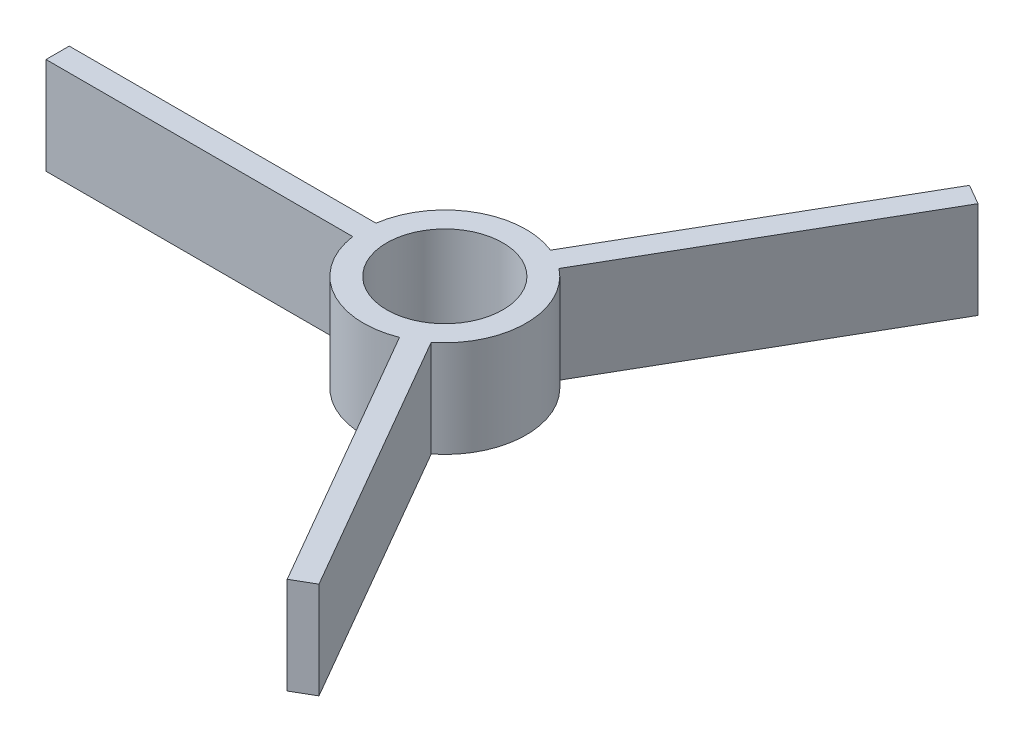
ISO-10303-21;
HEADER;
FILE_DESCRIPTION(('STEP AP214'),'2;1');
FILE_NAME('part.step','',(''),(''),'','','');
FILE_SCHEMA(('AUTOMOTIVE_DESIGN { 1 0 10303 214 1 1 1 1 }'));
ENDSEC;
DATA;
#1=APPLICATION_CONTEXT('core data for automotive mechanical design processes');
#2=APPLICATION_PROTOCOL_DEFINITION('international standard','automotive_design',2000,#1);
#3=PRODUCT_CONTEXT('',#1,'mechanical');
#4=PRODUCT('Part','Part','',(#3));
#5=PRODUCT_RELATED_PRODUCT_CATEGORY('part','',(#4));
#6=PRODUCT_DEFINITION_FORMATION('','',#4);
#7=PRODUCT_DEFINITION_CONTEXT('part definition',#1,'design');
#8=PRODUCT_DEFINITION('design','',#6,#7);
#9=PRODUCT_DEFINITION_SHAPE('','',#8);
#10=(LENGTH_UNIT() NAMED_UNIT(*) SI_UNIT(.MILLI.,.METRE.));
#11=(NAMED_UNIT(*) PLANE_ANGLE_UNIT() SI_UNIT($,.RADIAN.));
#12=(NAMED_UNIT(*) SI_UNIT($,.STERADIAN.) SOLID_ANGLE_UNIT());
#13=UNCERTAINTY_MEASURE_WITH_UNIT(LENGTH_MEASURE(1.E-05),#10,'distance_accuracy_value','');
#14=(GEOMETRIC_REPRESENTATION_CONTEXT(3) GLOBAL_UNCERTAINTY_ASSIGNED_CONTEXT((#13)) GLOBAL_UNIT_ASSIGNED_CONTEXT((#10,
#11,#12)) REPRESENTATION_CONTEXT('',''));
#15=CARTESIAN_POINT('',(0.,0.,0.));
#16=DIRECTION('',(0.,0.,1.));
#17=DIRECTION('',(1.,0.,0.));
#18=AXIS2_PLACEMENT_3D('',#15,#16,#17);
#19=CARTESIAN_POINT('',(0.,5.,0.));
#20=DIRECTION('',(0.,1.,0.));
#21=DIRECTION('',(0.,0.,1.));
#22=AXIS2_PLACEMENT_3D('',#19,#20,#21);
#23=PLANE('',#22);
#24=CARTESIAN_POINT('',(0.,5.,0.));
#25=DIRECTION('',(0.,1.,0.));
#26=DIRECTION('',(0.,0.,1.));
#27=AXIS2_PLACEMENT_3D('',#24,#25,#26);
#28=CIRCLE('',#27,4.2);
#29=CARTESIAN_POINT('',(-4.15692193816531,5.,0.6));
#30=VERTEX_POINT('',#29);
#31=CARTESIAN_POINT('',(1.55884572681199,5.,3.9));
#32=VERTEX_POINT('',#31);
#33=EDGE_CURVE('E186',#30,#32,#28,.T.);
#34=ORIENTED_EDGE('',*,*,#33,.T.);
#35=DIRECTION('',(0.500000000000001,0.,0.866025403784438));
#36=VECTOR('',#35,1.);
#37=CARTESIAN_POINT('',(1.55884572681199,5.,3.9));
#38=LINE('',#37,#36);
#39=CARTESIAN_POINT('',(9.48038475772935,5.,17.6205080756888));
#40=VERTEX_POINT('',#39);
#41=EDGE_CURVE('E114',#32,#40,#38,.T.);
#42=ORIENTED_EDGE('',*,*,#41,.T.);
#43=DIRECTION('',(0.866025403784439,0.,-0.5));
#44=VECTOR('',#43,1.);
#45=CARTESIAN_POINT('',(9.48038475772935,5.,17.6205080756888));
#46=LINE('',#45,#44);
#47=CARTESIAN_POINT('',(10.5196152422707,5.,17.0205080756888));
#48=VERTEX_POINT('',#47);
#49=EDGE_CURVE('E213',#40,#48,#46,.T.);
#50=ORIENTED_EDGE('',*,*,#49,.T.);
#51=DIRECTION('',(-0.500000000000001,0.,-0.866025403784438));
#52=VECTOR('',#51,1.);
#53=CARTESIAN_POINT('',(2.59807621135332,5.,3.3));
#54=LINE('',#53,#52);
#55=CARTESIAN_POINT('',(2.59807621135332,5.,3.3));
#56=VERTEX_POINT('',#55);
#57=EDGE_CURVE('E232',#48,#56,#54,.T.);
#58=ORIENTED_EDGE('',*,*,#57,.T.);
#59=CARTESIAN_POINT('',(0.,5.,0.));
#60=DIRECTION('',(0.,1.,0.));
#61=DIRECTION('',(0.,0.,1.));
#62=AXIS2_PLACEMENT_3D('',#59,#60,#61);
#63=CIRCLE('',#62,4.2);
#64=CARTESIAN_POINT('',(2.59807621135331,5.,-3.3));
#65=VERTEX_POINT('',#64);
#66=EDGE_CURVE('E229',#56,#65,#63,.T.);
#67=ORIENTED_EDGE('',*,*,#66,.T.);
#68=DIRECTION('',(0.5,0.,-0.866025403784439));
#69=VECTOR('',#68,1.);
#70=CARTESIAN_POINT('',(2.59807621135331,5.,-3.3));
#71=LINE('',#70,#69);
#72=CARTESIAN_POINT('',(10.5196152422707,5.,-17.0205080756888));
#73=VERTEX_POINT('',#72);
#74=EDGE_CURVE('E231',#65,#73,#71,.T.);
#75=ORIENTED_EDGE('',*,*,#74,.T.);
#76=DIRECTION('',(-0.866025403784439,0.,-0.5));
#77=VECTOR('',#76,1.);
#78=CARTESIAN_POINT('',(10.5196152422707,5.,-17.0205080756888));
#79=LINE('',#78,#77);
#80=CARTESIAN_POINT('',(9.48038475772933,5.,-17.6205080756888));
#81=VERTEX_POINT('',#80);
#82=EDGE_CURVE('E234',#73,#81,#79,.T.);
#83=ORIENTED_EDGE('',*,*,#82,.T.);
#84=DIRECTION('',(-0.5,0.,0.866025403784439));
#85=VECTOR('',#84,1.);
#86=CARTESIAN_POINT('',(1.55884572681199,5.,-3.9));
#87=LINE('',#86,#85);
#88=CARTESIAN_POINT('',(1.55884572681199,5.,-3.9));
#89=VERTEX_POINT('',#88);
#90=EDGE_CURVE('E240',#81,#89,#87,.T.);
#91=ORIENTED_EDGE('',*,*,#90,.T.);
#92=CARTESIAN_POINT('',(0.,5.,0.));
#93=DIRECTION('',(0.,1.,0.));
#94=DIRECTION('',(0.,0.,1.));
#95=AXIS2_PLACEMENT_3D('',#92,#93,#94);
#96=CIRCLE('',#95,4.2);
#97=CARTESIAN_POINT('',(-4.15692193816531,5.,-0.599999999999999));
#98=VERTEX_POINT('',#97);
#99=EDGE_CURVE('E145',#89,#98,#96,.T.);
#100=ORIENTED_EDGE('',*,*,#99,.T.);
#101=DIRECTION('',(-1.,0.,0.));
#102=VECTOR('',#101,1.);
#103=CARTESIAN_POINT('',(-4.15692193816531,5.,-0.599999999999999));
#104=LINE('',#103,#102);
#105=CARTESIAN_POINT('',(-20.,5.,-0.599999999999997));
#106=VERTEX_POINT('',#105);
#107=EDGE_CURVE('E139',#98,#106,#104,.T.);
#108=ORIENTED_EDGE('',*,*,#107,.T.);
#109=DIRECTION('',(0.,0.,1.));
#110=VECTOR('',#109,1.);
#111=CARTESIAN_POINT('',(-20.,5.,-0.599999999999997));
#112=LINE('',#111,#110);
#113=CARTESIAN_POINT('',(-20.,5.,0.600000000000002));
#114=VERTEX_POINT('',#113);
#115=EDGE_CURVE('E143',#106,#114,#112,.T.);
#116=ORIENTED_EDGE('',*,*,#115,.T.);
#117=DIRECTION('',(1.,0.,0.));
#118=VECTOR('',#117,1.);
#119=CARTESIAN_POINT('',(-4.15692193816531,5.,0.6));
#120=LINE('',#119,#118);
#121=EDGE_CURVE('E59',#114,#30,#120,.T.);
#122=ORIENTED_EDGE('',*,*,#121,.T.);
#123=EDGE_LOOP('',(#34,#42,#50,#58,#67,#75,#83,#91,#100,#108,#116,#122));
#124=FACE_BOUND('',#123,.T.);
#125=CARTESIAN_POINT('',(0.,5.,0.));
#126=DIRECTION('',(0.,1.,0.));
#127=DIRECTION('',(0.,0.,1.));
#128=AXIS2_PLACEMENT_3D('',#125,#126,#127);
#129=CIRCLE('',#128,3.);
#130=CARTESIAN_POINT('',(0.,5.,3.));
#131=VERTEX_POINT('',#130);
#132=EDGE_CURVE('E167',#131,#131,#129,.T.);
#133=ORIENTED_EDGE('',*,*,#132,.F.);
#134=EDGE_LOOP('',(#133));
#135=FACE_BOUND('',#134,.T.);
#136=ADVANCED_FACE('F42',(#124,#135),#23,.T.);
#137=CARTESIAN_POINT('',(0.,0.,0.));
#138=DIRECTION('',(0.,1.,0.));
#139=DIRECTION('',(0.,0.,1.));
#140=AXIS2_PLACEMENT_3D('',#137,#138,#139);
#141=PLANE('',#140);
#142=CARTESIAN_POINT('',(0.,0.,0.));
#143=DIRECTION('',(0.,1.,0.));
#144=DIRECTION('',(0.,0.,1.));
#145=AXIS2_PLACEMENT_3D('',#142,#143,#144);
#146=CIRCLE('',#145,4.2);
#147=CARTESIAN_POINT('',(-4.15692193816531,0.,0.6));
#148=VERTEX_POINT('',#147);
#149=CARTESIAN_POINT('',(1.55884572681199,0.,3.9));
#150=VERTEX_POINT('',#149);
#151=EDGE_CURVE('E163',#148,#150,#146,.T.);
#152=ORIENTED_EDGE('',*,*,#151,.F.);
#153=DIRECTION('',(1.,0.,0.));
#154=VECTOR('',#153,1.);
#155=CARTESIAN_POINT('',(-4.15692193816531,0.,0.6));
#156=LINE('',#155,#154);
#157=CARTESIAN_POINT('',(-20.,0.,0.600000000000002));
#158=VERTEX_POINT('',#157);
#159=EDGE_CURVE('E106',#158,#148,#156,.T.);
#160=ORIENTED_EDGE('',*,*,#159,.F.);
#161=DIRECTION('',(0.,0.,1.));
#162=VECTOR('',#161,1.);
#163=CARTESIAN_POINT('',(-20.,0.,-0.599999999999997));
#164=LINE('',#163,#162);
#165=CARTESIAN_POINT('',(-20.,0.,-0.599999999999997));
#166=VERTEX_POINT('',#165);
#167=EDGE_CURVE('E100',#166,#158,#164,.T.);
#168=ORIENTED_EDGE('',*,*,#167,.F.);
#169=DIRECTION('',(-1.,0.,0.));
#170=VECTOR('',#169,1.);
#171=CARTESIAN_POINT('',(-4.15692193816531,0.,-0.599999999999999));
#172=LINE('',#171,#170);
#173=CARTESIAN_POINT('',(-4.15692193816531,0.,-0.599999999999999));
#174=VERTEX_POINT('',#173);
#175=EDGE_CURVE('E153',#174,#166,#172,.T.);
#176=ORIENTED_EDGE('',*,*,#175,.F.);
#177=CARTESIAN_POINT('',(0.,0.,0.));
#178=DIRECTION('',(0.,1.,0.));
#179=DIRECTION('',(0.,0.,1.));
#180=AXIS2_PLACEMENT_3D('',#177,#178,#179);
#181=CIRCLE('',#180,4.2);
#182=CARTESIAN_POINT('',(1.55884572681199,0.,-3.9));
#183=VERTEX_POINT('',#182);
#184=EDGE_CURVE('E181',#183,#174,#181,.T.);
#185=ORIENTED_EDGE('',*,*,#184,.F.);
#186=DIRECTION('',(-0.5,0.,0.866025403784439));
#187=VECTOR('',#186,1.);
#188=CARTESIAN_POINT('',(1.55884572681199,0.,-3.9));
#189=LINE('',#188,#187);
#190=CARTESIAN_POINT('',(9.48038475772933,0.,-17.6205080756888));
#191=VERTEX_POINT('',#190);
#192=EDGE_CURVE('E179',#191,#183,#189,.T.);
#193=ORIENTED_EDGE('',*,*,#192,.F.);
#194=DIRECTION('',(-0.866025403784439,0.,-0.5));
#195=VECTOR('',#194,1.);
#196=CARTESIAN_POINT('',(10.5196152422707,0.,-17.0205080756888));
#197=LINE('',#196,#195);
#198=CARTESIAN_POINT('',(10.5196152422707,0.,-17.0205080756888));
#199=VERTEX_POINT('',#198);
#200=EDGE_CURVE('E177',#199,#191,#197,.T.);
#201=ORIENTED_EDGE('',*,*,#200,.F.);
#202=DIRECTION('',(0.5,0.,-0.866025403784439));
#203=VECTOR('',#202,1.);
#204=CARTESIAN_POINT('',(2.59807621135331,0.,-3.3));
#205=LINE('',#204,#203);
#206=CARTESIAN_POINT('',(2.59807621135331,0.,-3.3));
#207=VERTEX_POINT('',#206);
#208=EDGE_CURVE('E175',#207,#199,#205,.T.);
#209=ORIENTED_EDGE('',*,*,#208,.F.);
#210=CARTESIAN_POINT('',(0.,0.,0.));
#211=DIRECTION('',(0.,1.,0.));
#212=DIRECTION('',(0.,0.,1.));
#213=AXIS2_PLACEMENT_3D('',#210,#211,#212);
#214=CIRCLE('',#213,4.2);
#215=CARTESIAN_POINT('',(2.59807621135332,0.,3.3));
#216=VERTEX_POINT('',#215);
#217=EDGE_CURVE('E173',#216,#207,#214,.T.);
#218=ORIENTED_EDGE('',*,*,#217,.F.);
#219=DIRECTION('',(-0.500000000000001,0.,-0.866025403784438));
#220=VECTOR('',#219,1.);
#221=CARTESIAN_POINT('',(2.59807621135332,0.,3.3));
#222=LINE('',#221,#220);
#223=CARTESIAN_POINT('',(10.5196152422707,0.,17.0205080756888));
#224=VERTEX_POINT('',#223);
#225=EDGE_CURVE('E171',#224,#216,#222,.T.);
#226=ORIENTED_EDGE('',*,*,#225,.F.);
#227=DIRECTION('',(0.866025403784439,0.,-0.5));
#228=VECTOR('',#227,1.);
#229=CARTESIAN_POINT('',(9.48038475772935,0.,17.6205080756888));
#230=LINE('',#229,#228);
#231=CARTESIAN_POINT('',(9.48038475772935,0.,17.6205080756888));
#232=VERTEX_POINT('',#231);
#233=EDGE_CURVE('E169',#232,#224,#230,.T.);
#234=ORIENTED_EDGE('',*,*,#233,.F.);
#235=DIRECTION('',(0.500000000000001,0.,0.866025403784438));
#236=VECTOR('',#235,1.);
#237=CARTESIAN_POINT('',(1.55884572681199,0.,3.9));
#238=LINE('',#237,#236);
#239=EDGE_CURVE('E166',#150,#232,#238,.T.);
#240=ORIENTED_EDGE('',*,*,#239,.F.);
#241=EDGE_LOOP('',(#152,#160,#168,#176,#185,#193,#201,#209,#218,#226,#234,#240));
#242=FACE_BOUND('',#241,.T.);
#243=CARTESIAN_POINT('',(0.,0.,0.));
#244=DIRECTION('',(0.,1.,0.));
#245=DIRECTION('',(0.,0.,1.));
#246=AXIS2_PLACEMENT_3D('',#243,#244,#245);
#247=CIRCLE('',#246,3.);
#248=CARTESIAN_POINT('',(0.,0.,3.));
#249=VERTEX_POINT('',#248);
#250=EDGE_CURVE('E387',#249,#249,#247,.T.);
#251=ORIENTED_EDGE('',*,*,#250,.T.);
#252=EDGE_LOOP('',(#251));
#253=FACE_BOUND('',#252,.T.);
#254=ADVANCED_FACE('F217',(#242,#253),#141,.F.);
#255=CARTESIAN_POINT('',(0.,5.,0.));
#256=DIRECTION('',(0.,-1.,0.));
#257=DIRECTION('',(0.,0.,-1.));
#258=AXIS2_PLACEMENT_3D('',#255,#256,#257);
#259=CYLINDRICAL_SURFACE('',#258,4.2);
#260=ORIENTED_EDGE('',*,*,#151,.T.);
#261=DIRECTION('',(0.,-1.,0.));
#262=VECTOR('',#261,1.);
#263=CARTESIAN_POINT('',(1.55884572681199,5.,3.9));
#264=LINE('',#263,#262);
#265=EDGE_CURVE('E13',#32,#150,#264,.T.);
#266=ORIENTED_EDGE('',*,*,#265,.F.);
#267=ORIENTED_EDGE('',*,*,#33,.F.);
#268=DIRECTION('',(0.,-1.,0.));
#269=VECTOR('',#268,1.);
#270=CARTESIAN_POINT('',(-4.15692193816531,5.,0.6));
#271=LINE('',#270,#269);
#272=EDGE_CURVE('E159',#30,#148,#271,.T.);
#273=ORIENTED_EDGE('',*,*,#272,.T.);
#274=EDGE_LOOP('',(#260,#266,#267,#273));
#275=FACE_BOUND('',#274,.T.);
#276=ADVANCED_FACE('F44',(#275),#259,.T.);
#277=CARTESIAN_POINT('',(1.55884572681199,5.,3.9));
#278=DIRECTION('',(0.866025403784438,0.,-0.500000000000001));
#279=DIRECTION('',(-0.500000000000001,0.,-0.866025403784438));
#280=AXIS2_PLACEMENT_3D('',#277,#278,#279);
#281=PLANE('',#280);
#282=ORIENTED_EDGE('',*,*,#239,.T.);
#283=DIRECTION('',(0.,-1.,0.));
#284=VECTOR('',#283,1.);
#285=CARTESIAN_POINT('',(9.48038475772935,5.,17.6205080756888));
#286=LINE('',#285,#284);
#287=EDGE_CURVE('E51',#40,#232,#286,.T.);
#288=ORIENTED_EDGE('',*,*,#287,.F.);
#289=ORIENTED_EDGE('',*,*,#41,.F.);
#290=ORIENTED_EDGE('',*,*,#265,.T.);
#291=EDGE_LOOP('',(#282,#288,#289,#290));
#292=FACE_BOUND('',#291,.T.);
#293=ADVANCED_FACE('F274',(#292),#281,.F.);
#294=CARTESIAN_POINT('',(9.48038475772935,5.,17.6205080756888));
#295=DIRECTION('',(-0.5,0.,-0.866025403784439));
#296=DIRECTION('',(-0.866025403784439,0.,0.5));
#297=AXIS2_PLACEMENT_3D('',#294,#295,#296);
#298=PLANE('',#297);
#299=ORIENTED_EDGE('',*,*,#233,.T.);
#300=DIRECTION('',(0.,-1.,0.));
#301=VECTOR('',#300,1.);
#302=CARTESIAN_POINT('',(10.5196152422707,5.,17.0205080756888));
#303=LINE('',#302,#301);
#304=EDGE_CURVE('E205',#48,#224,#303,.T.);
#305=ORIENTED_EDGE('',*,*,#304,.F.);
#306=ORIENTED_EDGE('',*,*,#49,.F.);
#307=ORIENTED_EDGE('',*,*,#287,.T.);
#308=EDGE_LOOP('',(#299,#305,#306,#307));
#309=FACE_BOUND('',#308,.T.);
#310=ADVANCED_FACE('F211',(#309),#298,.F.);
#311=CARTESIAN_POINT('',(2.59807621135332,5.,3.3));
#312=DIRECTION('',(-0.866025403784438,0.,0.500000000000001));
#313=DIRECTION('',(0.500000000000001,0.,0.866025403784438));
#314=AXIS2_PLACEMENT_3D('',#311,#312,#313);
#315=PLANE('',#314);
#316=ORIENTED_EDGE('',*,*,#225,.T.);
#317=DIRECTION('',(0.,-1.,0.));
#318=VECTOR('',#317,1.);
#319=CARTESIAN_POINT('',(2.59807621135332,5.,3.3));
#320=LINE('',#319,#318);
#321=EDGE_CURVE('E202',#56,#216,#320,.T.);
#322=ORIENTED_EDGE('',*,*,#321,.F.);
#323=ORIENTED_EDGE('',*,*,#57,.F.);
#324=ORIENTED_EDGE('',*,*,#304,.T.);
#325=EDGE_LOOP('',(#316,#322,#323,#324));
#326=FACE_BOUND('',#325,.T.);
#327=ADVANCED_FACE('F223',(#326),#315,.F.);
#328=CARTESIAN_POINT('',(0.,5.,0.));
#329=DIRECTION('',(0.,-1.,0.));
#330=DIRECTION('',(0.,0.,-1.));
#331=AXIS2_PLACEMENT_3D('',#328,#329,#330);
#332=CYLINDRICAL_SURFACE('',#331,4.2);
#333=ORIENTED_EDGE('',*,*,#217,.T.);
#334=DIRECTION('',(0.,-1.,0.));
#335=VECTOR('',#334,1.);
#336=CARTESIAN_POINT('',(2.59807621135331,5.,-3.3));
#337=LINE('',#336,#335);
#338=EDGE_CURVE('E199',#65,#207,#337,.T.);
#339=ORIENTED_EDGE('',*,*,#338,.F.);
#340=ORIENTED_EDGE('',*,*,#66,.F.);
#341=ORIENTED_EDGE('',*,*,#321,.T.);
#342=EDGE_LOOP('',(#333,#339,#340,#341));
#343=FACE_BOUND('',#342,.T.);
#344=ADVANCED_FACE('F227',(#343),#332,.T.);
#345=CARTESIAN_POINT('',(2.59807621135331,5.,-3.3));
#346=DIRECTION('',(-0.866025403784439,0.,-0.5));
#347=DIRECTION('',(-0.5,0.,0.866025403784439));
#348=AXIS2_PLACEMENT_3D('',#345,#346,#347);
#349=PLANE('',#348);
#350=ORIENTED_EDGE('',*,*,#208,.T.);
#351=DIRECTION('',(0.,-1.,0.));
#352=VECTOR('',#351,1.);
#353=CARTESIAN_POINT('',(10.5196152422707,5.,-17.0205080756888));
#354=LINE('',#353,#352);
#355=EDGE_CURVE('E196',#73,#199,#354,.T.);
#356=ORIENTED_EDGE('',*,*,#355,.F.);
#357=ORIENTED_EDGE('',*,*,#74,.F.);
#358=ORIENTED_EDGE('',*,*,#338,.T.);
#359=EDGE_LOOP('',(#350,#356,#357,#358));
#360=FACE_BOUND('',#359,.T.);
#361=ADVANCED_FACE('F287',(#360),#349,.F.);
#362=CARTESIAN_POINT('',(10.5196152422707,5.,-17.0205080756888));
#363=DIRECTION('',(-0.5,0.,0.866025403784439));
#364=DIRECTION('',(0.866025403784439,0.,0.5));
#365=AXIS2_PLACEMENT_3D('',#362,#363,#364);
#366=PLANE('',#365);
#367=ORIENTED_EDGE('',*,*,#200,.T.);
#368=DIRECTION('',(0.,-1.,0.));
#369=VECTOR('',#368,1.);
#370=CARTESIAN_POINT('',(9.48038475772933,5.,-17.6205080756888));
#371=LINE('',#370,#369);
#372=EDGE_CURVE('E193',#81,#191,#371,.T.);
#373=ORIENTED_EDGE('',*,*,#372,.F.);
#374=ORIENTED_EDGE('',*,*,#82,.F.);
#375=ORIENTED_EDGE('',*,*,#355,.T.);
#376=EDGE_LOOP('',(#367,#373,#374,#375));
#377=FACE_BOUND('',#376,.T.);
#378=ADVANCED_FACE('F290',(#377),#366,.F.);
#379=CARTESIAN_POINT('',(1.55884572681199,5.,-3.9));
#380=DIRECTION('',(0.866025403784439,0.,0.5));
#381=DIRECTION('',(0.5,0.,-0.866025403784439));
#382=AXIS2_PLACEMENT_3D('',#379,#380,#381);
#383=PLANE('',#382);
#384=ORIENTED_EDGE('',*,*,#192,.T.);
#385=DIRECTION('',(0.,-1.,0.));
#386=VECTOR('',#385,1.);
#387=CARTESIAN_POINT('',(1.55884572681199,5.,-3.9));
#388=LINE('',#387,#386);
#389=EDGE_CURVE('E190',#89,#183,#388,.T.);
#390=ORIENTED_EDGE('',*,*,#389,.F.);
#391=ORIENTED_EDGE('',*,*,#90,.F.);
#392=ORIENTED_EDGE('',*,*,#372,.T.);
#393=EDGE_LOOP('',(#384,#390,#391,#392));
#394=FACE_BOUND('',#393,.T.);
#395=ADVANCED_FACE('F246',(#394),#383,.F.);
#396=CARTESIAN_POINT('',(0.,5.,0.));
#397=DIRECTION('',(0.,-1.,0.));
#398=DIRECTION('',(0.,0.,-1.));
#399=AXIS2_PLACEMENT_3D('',#396,#397,#398);
#400=CYLINDRICAL_SURFACE('',#399,4.2);
#401=ORIENTED_EDGE('',*,*,#184,.T.);
#402=DIRECTION('',(0.,-1.,0.));
#403=VECTOR('',#402,1.);
#404=CARTESIAN_POINT('',(-4.15692193816531,5.,-0.599999999999999));
#405=LINE('',#404,#403);
#406=EDGE_CURVE('E154',#98,#174,#405,.T.);
#407=ORIENTED_EDGE('',*,*,#406,.F.);
#408=ORIENTED_EDGE('',*,*,#99,.F.);
#409=ORIENTED_EDGE('',*,*,#389,.T.);
#410=EDGE_LOOP('',(#401,#407,#408,#409));
#411=FACE_BOUND('',#410,.T.);
#412=ADVANCED_FACE('F250',(#411),#400,.T.);
#413=CARTESIAN_POINT('',(-4.15692193816531,5.,-0.599999999999999));
#414=DIRECTION('',(0.,0.,1.));
#415=DIRECTION('',(1.,0.,0.));
#416=AXIS2_PLACEMENT_3D('',#413,#414,#415);
#417=PLANE('',#416);
#418=ORIENTED_EDGE('',*,*,#175,.T.);
#419=DIRECTION('',(0.,-1.,0.));
#420=VECTOR('',#419,1.);
#421=CARTESIAN_POINT('',(-20.,5.,-0.599999999999997));
#422=LINE('',#421,#420);
#423=EDGE_CURVE('E150',#106,#166,#422,.T.);
#424=ORIENTED_EDGE('',*,*,#423,.F.);
#425=ORIENTED_EDGE('',*,*,#107,.F.);
#426=ORIENTED_EDGE('',*,*,#406,.T.);
#427=EDGE_LOOP('',(#418,#424,#425,#426));
#428=FACE_BOUND('',#427,.T.);
#429=ADVANCED_FACE('F151',(#428),#417,.F.);
#430=CARTESIAN_POINT('',(-20.,5.,-0.599999999999997));
#431=DIRECTION('',(1.,0.,0.));
#432=DIRECTION('',(0.,0.,-1.));
#433=AXIS2_PLACEMENT_3D('',#430,#431,#432);
#434=PLANE('',#433);
#435=ORIENTED_EDGE('',*,*,#167,.T.);
#436=DIRECTION('',(0.,-1.,0.));
#437=VECTOR('',#436,1.);
#438=CARTESIAN_POINT('',(-20.,5.,0.600000000000002));
#439=LINE('',#438,#437);
#440=EDGE_CURVE('E155',#114,#158,#439,.T.);
#441=ORIENTED_EDGE('',*,*,#440,.F.);
#442=ORIENTED_EDGE('',*,*,#115,.F.);
#443=ORIENTED_EDGE('',*,*,#423,.T.);
#444=EDGE_LOOP('',(#435,#441,#442,#443));
#445=FACE_BOUND('',#444,.T.);
#446=ADVANCED_FACE('F157',(#445),#434,.F.);
#447=CARTESIAN_POINT('',(-4.15692193816531,5.,0.6));
#448=DIRECTION('',(0.,0.,-1.));
#449=DIRECTION('',(-1.,0.,0.));
#450=AXIS2_PLACEMENT_3D('',#447,#448,#449);
#451=PLANE('',#450);
#452=ORIENTED_EDGE('',*,*,#159,.T.);
#453=ORIENTED_EDGE('',*,*,#272,.F.);
#454=ORIENTED_EDGE('',*,*,#121,.F.);
#455=ORIENTED_EDGE('',*,*,#440,.T.);
#456=EDGE_LOOP('',(#452,#453,#454,#455));
#457=FACE_BOUND('',#456,.T.);
#458=ADVANCED_FACE('F254',(#457),#451,.F.);
#459=CARTESIAN_POINT('',(0.,5.,0.));
#460=DIRECTION('',(0.,-1.,0.));
#461=DIRECTION('',(0.,0.,-1.));
#462=AXIS2_PLACEMENT_3D('',#459,#460,#461);
#463=CYLINDRICAL_SURFACE('',#462,3.);
#464=ORIENTED_EDGE('',*,*,#132,.T.);
#465=EDGE_LOOP('',(#464));
#466=FACE_BOUND('',#465,.T.);
#467=ORIENTED_EDGE('',*,*,#250,.F.);
#468=EDGE_LOOP('',(#467));
#469=FACE_BOUND('',#468,.T.);
#470=ADVANCED_FACE('F256',(#466,#469),#463,.F.);
#471=CLOSED_SHELL('',(#136,#254,#276,#293,#310,#327,#344,#361,#378,#395,#412,#429,#446,#458,#470));
#472=MANIFOLD_SOLID_BREP('B2',#471);
#473=ADVANCED_BREP_SHAPE_REPRESENTATION('',(#18,#472),#14);
#474=SHAPE_DEFINITION_REPRESENTATION(#9,#473);
ENDSEC;
END-ISO-10303-21;
